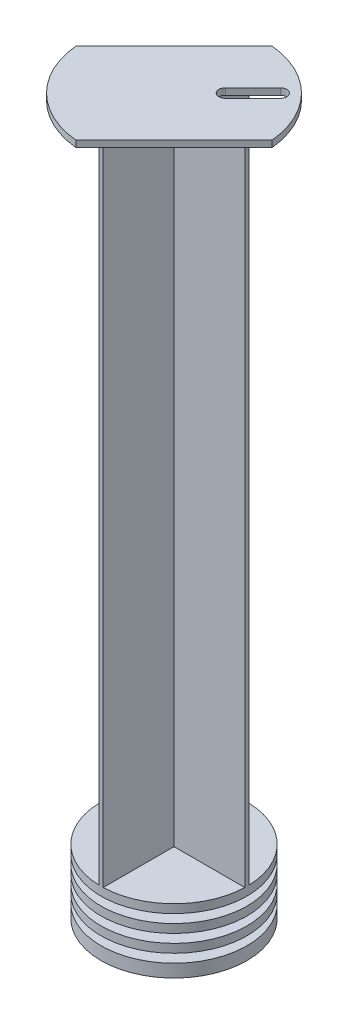
ISO-10303-21;
HEADER;
FILE_DESCRIPTION(('STEP AP214'),'2;1');
FILE_NAME('part.step','',(''),(''),'','','');
FILE_SCHEMA(('AUTOMOTIVE_DESIGN { 1 0 10303 214 1 1 1 1 }'));
ENDSEC;
DATA;
#1=APPLICATION_CONTEXT('core data for automotive mechanical design processes');
#2=APPLICATION_PROTOCOL_DEFINITION('international standard','automotive_design',2000,#1);
#3=PRODUCT_CONTEXT('',#1,'mechanical');
#4=PRODUCT('Part','Part','',(#3));
#5=PRODUCT_RELATED_PRODUCT_CATEGORY('part','',(#4));
#6=PRODUCT_DEFINITION_FORMATION('','',#4);
#7=PRODUCT_DEFINITION_CONTEXT('part definition',#1,'design');
#8=PRODUCT_DEFINITION('design','',#6,#7);
#9=PRODUCT_DEFINITION_SHAPE('','',#8);
#10=(LENGTH_UNIT() NAMED_UNIT(*) SI_UNIT(.MILLI.,.METRE.));
#11=(NAMED_UNIT(*) PLANE_ANGLE_UNIT() SI_UNIT($,.RADIAN.));
#12=(NAMED_UNIT(*) SI_UNIT($,.STERADIAN.) SOLID_ANGLE_UNIT());
#13=UNCERTAINTY_MEASURE_WITH_UNIT(LENGTH_MEASURE(1.E-05),#10,'distance_accuracy_value','');
#14=(GEOMETRIC_REPRESENTATION_CONTEXT(3) GLOBAL_UNCERTAINTY_ASSIGNED_CONTEXT((#13)) GLOBAL_UNIT_ASSIGNED_CONTEXT((#10,
#11,#12)) REPRESENTATION_CONTEXT('',''));
#15=CARTESIAN_POINT('',(0.,0.,0.));
#16=DIRECTION('',(0.,0.,1.));
#17=DIRECTION('',(1.,0.,0.));
#18=AXIS2_PLACEMENT_3D('',#15,#16,#17);
#19=CARTESIAN_POINT('',(0.,165.,0.));
#20=DIRECTION('',(0.,1.,0.));
#21=DIRECTION('',(0.,0.,1.));
#22=AXIS2_PLACEMENT_3D('',#19,#20,#21);
#23=PLANE('',#22);
#24=DIRECTION('',(0.,0.,1.));
#25=VECTOR('',#24,1.);
#26=CARTESIAN_POINT('',(0.5,165.,0.));
#27=LINE('',#26,#25);
#28=CARTESIAN_POINT('',(0.499999999999996,165.,0.5));
#29=VERTEX_POINT('',#28);
#30=CARTESIAN_POINT('',(0.499999999999993,165.,16.9926454679664));
#31=VERTEX_POINT('',#30);
#32=EDGE_CURVE('E597',#29,#31,#27,.T.);
#33=ORIENTED_EDGE('',*,*,#32,.F.);
#34=DIRECTION('',(1.,0.,0.));
#35=VECTOR('',#34,1.);
#36=CARTESIAN_POINT('',(0.,165.,0.5));
#37=LINE('',#36,#35);
#38=CARTESIAN_POINT('',(16.9926454679664,165.,0.499999999999993));
#39=VERTEX_POINT('',#38);
#40=EDGE_CURVE('E523',#29,#39,#37,.T.);
#41=ORIENTED_EDGE('',*,*,#40,.T.);
#42=CARTESIAN_POINT('',(0.,165.,0.));
#43=DIRECTION('',(0.,1.,0.));
#44=DIRECTION('',(0.,0.,1.));
#45=AXIS2_PLACEMENT_3D('',#42,#43,#44);
#46=CIRCLE('',#45,17.);
#47=CARTESIAN_POINT('',(16.9926454679664,165.,-0.499999999999992));
#48=VERTEX_POINT('',#47);
#49=EDGE_CURVE('E526',#39,#48,#46,.T.);
#50=ORIENTED_EDGE('',*,*,#49,.T.);
#51=DIRECTION('',(1.,0.,0.));
#52=VECTOR('',#51,1.);
#53=CARTESIAN_POINT('',(0.,165.,-0.5));
#54=LINE('',#53,#52);
#55=CARTESIAN_POINT('',(0.499999999999995,165.,-0.5));
#56=VERTEX_POINT('',#55);
#57=EDGE_CURVE('E530',#56,#48,#54,.T.);
#58=ORIENTED_EDGE('',*,*,#57,.F.);
#59=DIRECTION('',(0.,0.,-1.));
#60=VECTOR('',#59,1.);
#61=CARTESIAN_POINT('',(0.5,165.,0.));
#62=LINE('',#61,#60);
#63=CARTESIAN_POINT('',(0.49999999999999,165.,-16.9926454679664));
#64=VERTEX_POINT('',#63);
#65=EDGE_CURVE('E561',#56,#64,#62,.T.);
#66=ORIENTED_EDGE('',*,*,#65,.T.);
#67=CARTESIAN_POINT('',(0.,165.,0.));
#68=DIRECTION('',(0.,1.,0.));
#69=DIRECTION('',(0.,0.,1.));
#70=AXIS2_PLACEMENT_3D('',#67,#68,#69);
#71=CIRCLE('',#70,17.);
#72=CARTESIAN_POINT('',(-0.5,165.,-16.9926454679664));
#73=VERTEX_POINT('',#72);
#74=EDGE_CURVE('E564',#64,#73,#71,.T.);
#75=ORIENTED_EDGE('',*,*,#74,.T.);
#76=DIRECTION('',(0.,0.,-1.));
#77=VECTOR('',#76,1.);
#78=CARTESIAN_POINT('',(-0.5,165.,0.));
#79=LINE('',#78,#77);
#80=CARTESIAN_POINT('',(-0.5,165.,-0.5));
#81=VERTEX_POINT('',#80);
#82=EDGE_CURVE('E548',#81,#73,#79,.T.);
#83=ORIENTED_EDGE('',*,*,#82,.F.);
#84=DIRECTION('',(-1.,0.,0.));
#85=VECTOR('',#84,1.);
#86=CARTESIAN_POINT('',(0.,165.,-0.5));
#87=LINE('',#86,#85);
#88=CARTESIAN_POINT('',(-16.9926454679664,165.,-0.499999999999991));
#89=VERTEX_POINT('',#88);
#90=EDGE_CURVE('E551',#81,#89,#87,.T.);
#91=ORIENTED_EDGE('',*,*,#90,.T.);
#92=CARTESIAN_POINT('',(0.,165.,0.));
#93=DIRECTION('',(0.,1.,0.));
#94=DIRECTION('',(0.,0.,1.));
#95=AXIS2_PLACEMENT_3D('',#92,#93,#94);
#96=CIRCLE('',#95,17.);
#97=CARTESIAN_POINT('',(-16.9926454679664,165.,0.499999999999993));
#98=VERTEX_POINT('',#97);
#99=EDGE_CURVE('E555',#89,#98,#96,.T.);
#100=ORIENTED_EDGE('',*,*,#99,.T.);
#101=DIRECTION('',(-1.,0.,0.));
#102=VECTOR('',#101,1.);
#103=CARTESIAN_POINT('',(0.,165.,0.5));
#104=LINE('',#103,#102);
#105=CARTESIAN_POINT('',(-0.5,165.,0.499999999999997));
#106=VERTEX_POINT('',#105);
#107=EDGE_CURVE('E558',#106,#98,#104,.T.);
#108=ORIENTED_EDGE('',*,*,#107,.F.);
#109=DIRECTION('',(0.,0.,1.));
#110=VECTOR('',#109,1.);
#111=CARTESIAN_POINT('',(-0.5,165.,0.));
#112=LINE('',#111,#110);
#113=CARTESIAN_POINT('',(-0.5,165.,16.9926454679664));
#114=VERTEX_POINT('',#113);
#115=EDGE_CURVE('E590',#106,#114,#112,.T.);
#116=ORIENTED_EDGE('',*,*,#115,.T.);
#117=CARTESIAN_POINT('',(0.,165.,0.));
#118=DIRECTION('',(0.,1.,0.));
#119=DIRECTION('',(0.,0.,1.));
#120=AXIS2_PLACEMENT_3D('',#117,#118,#119);
#121=CIRCLE('',#120,17.);
#122=EDGE_CURVE('E593',#114,#31,#121,.T.);
#123=ORIENTED_EDGE('',*,*,#122,.T.);
#124=EDGE_LOOP('',(#33,#41,#50,#58,#66,#75,#83,#91,#100,#108,#116,#123));
#125=FACE_BOUND('',#124,.T.);
#126=CARTESIAN_POINT('',(12.3743686707646,165.,-12.3743686707645));
#127=DIRECTION('',(0.,1.,0.));
#128=DIRECTION('',(0.,0.,1.));
#129=AXIS2_PLACEMENT_3D('',#126,#127,#128);
#130=CIRCLE('',#129,1.5);
#131=CARTESIAN_POINT('',(13.4350288425445,165.,-11.3137084989847));
#132=VERTEX_POINT('',#131);
#133=CARTESIAN_POINT('',(11.3137084989848,165.,-13.4350288425443));
#134=VERTEX_POINT('',#133);
#135=EDGE_CURVE('E509',#132,#134,#130,.T.);
#136=ORIENTED_EDGE('',*,*,#135,.T.);
#137=DIRECTION('',(-0.707106781186551,0.,0.707106781186544));
#138=VECTOR('',#137,1.);
#139=CARTESIAN_POINT('',(-1.06066017177982,165.,-1.06066017177983));
#140=LINE('',#139,#138);
#141=CARTESIAN_POINT('',(4.91554219338316,165.,-7.03686253694274));
#142=VERTEX_POINT('',#141);
#143=EDGE_CURVE('E463',#134,#142,#140,.T.);
#144=ORIENTED_EDGE('',*,*,#143,.T.);
#145=CARTESIAN_POINT('',(5.97620236516298,165.,-5.97620236516291));
#146=DIRECTION('',(0.,1.,0.));
#147=DIRECTION('',(0.,0.,1.));
#148=AXIS2_PLACEMENT_3D('',#145,#146,#147);
#149=CIRCLE('',#148,1.5);
#150=CARTESIAN_POINT('',(7.03686253694279,165.,-4.91554219338309));
#151=VERTEX_POINT('',#150);
#152=EDGE_CURVE('E504',#142,#151,#149,.T.);
#153=ORIENTED_EDGE('',*,*,#152,.T.);
#154=DIRECTION('',(-0.707106781186551,0.,0.707106781186544));
#155=VECTOR('',#154,1.);
#156=CARTESIAN_POINT('',(1.06066017177982,165.,1.06066017177983));
#157=LINE('',#156,#155);
#158=EDGE_CURVE('E507',#132,#151,#157,.T.);
#159=ORIENTED_EDGE('',*,*,#158,.F.);
#160=EDGE_LOOP('',(#136,#144,#153,#159));
#161=FACE_BOUND('',#160,.T.);
#162=DIRECTION('',(-0.707106781186551,0.,0.707106781186544));
#163=VECTOR('',#162,1.);
#164=CARTESIAN_POINT('',(-9.4999999999999,165.,-9.49999999999999));
#165=LINE('',#164,#163);
#166=CARTESIAN_POINT('',(1.91271221051351,165.,-20.9127122105133));
#167=VERTEX_POINT('',#166);
#168=CARTESIAN_POINT('',(-20.9127122105133,165.,1.91271221051332));
#169=VERTEX_POINT('',#168);
#170=EDGE_CURVE('E512',#167,#169,#165,.T.);
#171=ORIENTED_EDGE('',*,*,#170,.F.);
#172=CARTESIAN_POINT('',(0.,165.,0.));
#173=DIRECTION('',(0.,1.,0.));
#174=DIRECTION('',(0.,0.,1.));
#175=AXIS2_PLACEMENT_3D('',#172,#173,#174);
#176=CIRCLE('',#175,21.);
#177=CARTESIAN_POINT('',(20.9127122105133,165.,-1.91271221051331));
#178=VERTEX_POINT('',#177);
#179=EDGE_CURVE('E520',#178,#167,#176,.T.);
#180=ORIENTED_EDGE('',*,*,#179,.F.);
#181=DIRECTION('',(-0.707106781186551,0.,0.707106781186544));
#182=VECTOR('',#181,1.);
#183=CARTESIAN_POINT('',(9.4999999999999,165.,9.5));
#184=LINE('',#183,#182);
#185=CARTESIAN_POINT('',(-1.91271221051352,165.,20.9127122105133));
#186=VERTEX_POINT('',#185);
#187=EDGE_CURVE('E500',#178,#186,#184,.T.);
#188=ORIENTED_EDGE('',*,*,#187,.T.);
#189=EDGE_CURVE('E514',#169,#186,#176,.T.);
#190=ORIENTED_EDGE('',*,*,#189,.F.);
#191=EDGE_LOOP('',(#171,#180,#188,#190));
#192=FACE_BOUND('',#191,.T.);
#193=ADVANCED_FACE('F319',(#125,#161,#192),#23,.F.);
#194=CARTESIAN_POINT('',(0.,166.5,0.));
#195=DIRECTION('',(0.,-1.,0.));
#196=DIRECTION('',(0.,0.,-1.));
#197=AXIS2_PLACEMENT_3D('',#194,#195,#196);
#198=CYLINDRICAL_SURFACE('',#197,21.);
#199=DIRECTION('',(0.,1.,0.));
#200=VECTOR('',#199,1.);
#201=CARTESIAN_POINT('',(1.91271221051351,161.5,-20.9127122105133));
#202=LINE('',#201,#200);
#203=CARTESIAN_POINT('',(1.91271221051351,166.5,-20.9127122105133));
#204=VERTEX_POINT('',#203);
#205=EDGE_CURVE('E492',#167,#204,#202,.T.);
#206=ORIENTED_EDGE('',*,*,#205,.T.);
#207=CARTESIAN_POINT('',(0.,166.5,0.));
#208=DIRECTION('',(0.,1.,0.));
#209=DIRECTION('',(0.,0.,1.));
#210=AXIS2_PLACEMENT_3D('',#207,#208,#209);
#211=CIRCLE('',#210,21.);
#212=CARTESIAN_POINT('',(20.9127122105133,166.5,-1.91271221051331));
#213=VERTEX_POINT('',#212);
#214=EDGE_CURVE('E515',#213,#204,#211,.T.);
#215=ORIENTED_EDGE('',*,*,#214,.F.);
#216=DIRECTION('',(0.,1.,0.));
#217=VECTOR('',#216,1.);
#218=CARTESIAN_POINT('',(20.9127122105133,161.5,-1.91271221051331));
#219=LINE('',#218,#217);
#220=EDGE_CURVE('E485',#178,#213,#219,.T.);
#221=ORIENTED_EDGE('',*,*,#220,.F.);
#222=ORIENTED_EDGE('',*,*,#179,.T.);
#223=EDGE_LOOP('',(#206,#215,#221,#222));
#224=FACE_BOUND('',#223,.T.);
#225=ADVANCED_FACE('F663',(#224),#198,.T.);
#226=DIRECTION('',(0.,1.,0.));
#227=VECTOR('',#226,1.);
#228=CARTESIAN_POINT('',(-20.9127122105133,161.5,1.91271221051332));
#229=LINE('',#228,#227);
#230=CARTESIAN_POINT('',(-20.9127122105133,166.5,1.91271221051332));
#231=VERTEX_POINT('',#230);
#232=EDGE_CURVE('E490',#169,#231,#229,.T.);
#233=ORIENTED_EDGE('',*,*,#232,.F.);
#234=ORIENTED_EDGE('',*,*,#189,.T.);
#235=DIRECTION('',(0.,1.,0.));
#236=VECTOR('',#235,1.);
#237=CARTESIAN_POINT('',(-1.91271221051352,161.5,20.9127122105133));
#238=LINE('',#237,#236);
#239=CARTESIAN_POINT('',(-1.91271221051352,166.5,20.9127122105133));
#240=VERTEX_POINT('',#239);
#241=EDGE_CURVE('E497',#186,#240,#238,.T.);
#242=ORIENTED_EDGE('',*,*,#241,.T.);
#243=EDGE_CURVE('E519',#231,#240,#211,.T.);
#244=ORIENTED_EDGE('',*,*,#243,.F.);
#245=EDGE_LOOP('',(#233,#234,#242,#244));
#246=FACE_BOUND('',#245,.T.);
#247=ADVANCED_FACE('F670',(#246),#198,.T.);
#248=CARTESIAN_POINT('',(0.,166.5,0.));
#249=DIRECTION('',(0.,1.,0.));
#250=DIRECTION('',(0.,0.,1.));
#251=AXIS2_PLACEMENT_3D('',#248,#249,#250);
#252=PLANE('',#251);
#253=DIRECTION('',(-0.707106781186551,0.,0.707106781186544));
#254=VECTOR('',#253,1.);
#255=CARTESIAN_POINT('',(-1.06066017177982,166.5,-1.06066017177983));
#256=LINE('',#255,#254);
#257=CARTESIAN_POINT('',(11.3137084989848,166.5,-13.4350288425443));
#258=VERTEX_POINT('',#257);
#259=CARTESIAN_POINT('',(4.91554219338316,166.5,-7.03686253694274));
#260=VERTEX_POINT('',#259);
#261=EDGE_CURVE('E343',#258,#260,#256,.T.);
#262=ORIENTED_EDGE('',*,*,#261,.F.);
#263=CARTESIAN_POINT('',(12.3743686707646,166.5,-12.3743686707645));
#264=DIRECTION('',(0.,1.,0.));
#265=DIRECTION('',(0.,0.,1.));
#266=AXIS2_PLACEMENT_3D('',#263,#264,#265);
#267=CIRCLE('',#266,1.5);
#268=CARTESIAN_POINT('',(13.4350288425445,166.5,-11.3137084989847));
#269=VERTEX_POINT('',#268);
#270=EDGE_CURVE('E470',#269,#258,#267,.T.);
#271=ORIENTED_EDGE('',*,*,#270,.F.);
#272=DIRECTION('',(-0.707106781186551,0.,0.707106781186544));
#273=VECTOR('',#272,1.);
#274=CARTESIAN_POINT('',(1.06066017177982,166.5,1.06066017177983));
#275=LINE('',#274,#273);
#276=CARTESIAN_POINT('',(7.03686253694279,166.5,-4.91554219338309));
#277=VERTEX_POINT('',#276);
#278=EDGE_CURVE('E476',#269,#277,#275,.T.);
#279=ORIENTED_EDGE('',*,*,#278,.T.);
#280=CARTESIAN_POINT('',(5.97620236516298,166.5,-5.97620236516291));
#281=DIRECTION('',(0.,1.,0.));
#282=DIRECTION('',(0.,0.,1.));
#283=AXIS2_PLACEMENT_3D('',#280,#281,#282);
#284=CIRCLE('',#283,1.5);
#285=EDGE_CURVE('E482',#260,#277,#284,.T.);
#286=ORIENTED_EDGE('',*,*,#285,.F.);
#287=EDGE_LOOP('',(#262,#271,#279,#286));
#288=FACE_BOUND('',#287,.T.);
#289=ORIENTED_EDGE('',*,*,#214,.T.);
#290=DIRECTION('',(-0.707106781186551,0.,0.707106781186544));
#291=VECTOR('',#290,1.);
#292=CARTESIAN_POINT('',(1.91271221051352,166.5,-20.9127122105133));
#293=LINE('',#292,#291);
#294=EDGE_CURVE('E467',#204,#231,#293,.T.);
#295=ORIENTED_EDGE('',*,*,#294,.T.);
#296=ORIENTED_EDGE('',*,*,#243,.T.);
#297=DIRECTION('',(-0.707106781186551,0.,0.707106781186544));
#298=VECTOR('',#297,1.);
#299=CARTESIAN_POINT('',(9.49999999999991,166.5,9.5));
#300=LINE('',#299,#298);
#301=EDGE_CURVE('E483',#213,#240,#300,.T.);
#302=ORIENTED_EDGE('',*,*,#301,.F.);
#303=EDGE_LOOP('',(#289,#295,#296,#302));
#304=FACE_BOUND('',#303,.T.);
#305=ADVANCED_FACE('F480',(#288,#304),#252,.T.);
#306=CARTESIAN_POINT('',(0.,15.,0.));
#307=DIRECTION('',(0.,1.,0.));
#308=DIRECTION('',(0.,0.,1.));
#309=AXIS2_PLACEMENT_3D('',#306,#307,#308);
#310=PLANE('',#309);
#311=DIRECTION('',(1.,0.,0.));
#312=VECTOR('',#311,1.);
#313=CARTESIAN_POINT('',(0.,15.,0.5));
#314=LINE('',#313,#312);
#315=CARTESIAN_POINT('',(0.499999999999996,15.,0.5));
#316=VERTEX_POINT('',#315);
#317=CARTESIAN_POINT('',(16.9926454679664,15.,0.499999999999993));
#318=VERTEX_POINT('',#317);
#319=EDGE_CURVE('E534',#316,#318,#314,.T.);
#320=ORIENTED_EDGE('',*,*,#319,.F.);
#321=DIRECTION('',(0.,0.,1.));
#322=VECTOR('',#321,1.);
#323=CARTESIAN_POINT('',(0.5,15.,0.));
#324=LINE('',#323,#322);
#325=CARTESIAN_POINT('',(0.499999999999993,15.,16.9926454679664));
#326=VERTEX_POINT('',#325);
#327=EDGE_CURVE('E594',#316,#326,#324,.T.);
#328=ORIENTED_EDGE('',*,*,#327,.T.);
#329=CARTESIAN_POINT('',(0.,15.,0.));
#330=DIRECTION('',(0.,1.,0.));
#331=DIRECTION('',(0.,0.,1.));
#332=AXIS2_PLACEMENT_3D('',#329,#330,#331);
#333=CIRCLE('',#332,17.);
#334=EDGE_CURVE('E12',#326,#318,#333,.T.);
#335=ORIENTED_EDGE('',*,*,#334,.T.);
#336=EDGE_LOOP('',(#320,#328,#335));
#337=FACE_BOUND('',#336,.T.);
#338=ADVANCED_FACE('F768',(#337),#310,.T.);
#339=DIRECTION('',(0.,0.,1.));
#340=VECTOR('',#339,1.);
#341=CARTESIAN_POINT('',(-0.5,15.,0.));
#342=LINE('',#341,#340);
#343=CARTESIAN_POINT('',(-0.5,15.,0.499999999999997));
#344=VERTEX_POINT('',#343);
#345=CARTESIAN_POINT('',(-0.5,15.,16.9926454679664));
#346=VERTEX_POINT('',#345);
#347=EDGE_CURVE('E518',#344,#346,#342,.T.);
#348=ORIENTED_EDGE('',*,*,#347,.F.);
#349=DIRECTION('',(-1.,0.,0.));
#350=VECTOR('',#349,1.);
#351=CARTESIAN_POINT('',(0.,15.,0.5));
#352=LINE('',#351,#350);
#353=CARTESIAN_POINT('',(-16.9926454679664,15.,0.499999999999993));
#354=VERTEX_POINT('',#353);
#355=EDGE_CURVE('E574',#344,#354,#352,.T.);
#356=ORIENTED_EDGE('',*,*,#355,.T.);
#357=EDGE_CURVE('E328',#354,#346,#333,.T.);
#358=ORIENTED_EDGE('',*,*,#357,.T.);
#359=EDGE_LOOP('',(#348,#356,#358));
#360=FACE_BOUND('',#359,.T.);
#361=ADVANCED_FACE('F770',(#360),#310,.T.);
#362=DIRECTION('',(-1.,0.,0.));
#363=VECTOR('',#362,1.);
#364=CARTESIAN_POINT('',(0.,15.,-0.5));
#365=LINE('',#364,#363);
#366=CARTESIAN_POINT('',(-0.5,15.,-0.5));
#367=VERTEX_POINT('',#366);
#368=CARTESIAN_POINT('',(-16.9926454679664,15.,-0.499999999999991));
#369=VERTEX_POINT('',#368);
#370=EDGE_CURVE('E571',#367,#369,#365,.T.);
#371=ORIENTED_EDGE('',*,*,#370,.F.);
#372=DIRECTION('',(0.,0.,-1.));
#373=VECTOR('',#372,1.);
#374=CARTESIAN_POINT('',(-0.5,15.,0.));
#375=LINE('',#374,#373);
#376=CARTESIAN_POINT('',(-0.5,15.,-16.9926454679664));
#377=VERTEX_POINT('',#376);
#378=EDGE_CURVE('E568',#367,#377,#375,.T.);
#379=ORIENTED_EDGE('',*,*,#378,.T.);
#380=EDGE_CURVE('E795',#377,#369,#333,.T.);
#381=ORIENTED_EDGE('',*,*,#380,.T.);
#382=EDGE_LOOP('',(#371,#379,#381));
#383=FACE_BOUND('',#382,.T.);
#384=ADVANCED_FACE('F762',(#383),#310,.T.);
#385=CARTESIAN_POINT('',(0.,15.,0.));
#386=DIRECTION('',(0.,-1.,0.));
#387=DIRECTION('',(0.,0.,-1.));
#388=AXIS2_PLACEMENT_3D('',#385,#386,#387);
#389=CYLINDRICAL_SURFACE('',#388,17.);
#390=ORIENTED_EDGE('',*,*,#334,.F.);
#391=DIRECTION('',(0.,-1.,0.));
#392=VECTOR('',#391,1.);
#393=CARTESIAN_POINT('',(0.499999999999993,165.,16.9926454679664));
#394=LINE('',#393,#392);
#395=EDGE_CURVE('E599',#31,#326,#394,.T.);
#396=ORIENTED_EDGE('',*,*,#395,.F.);
#397=ORIENTED_EDGE('',*,*,#122,.F.);
#398=DIRECTION('',(0.,-1.,0.));
#399=VECTOR('',#398,1.);
#400=CARTESIAN_POINT('',(-0.5,165.,16.9926454679664));
#401=LINE('',#400,#399);
#402=EDGE_CURVE('E572',#114,#346,#401,.T.);
#403=ORIENTED_EDGE('',*,*,#402,.T.);
#404=ORIENTED_EDGE('',*,*,#357,.F.);
#405=DIRECTION('',(0.,-1.,0.));
#406=VECTOR('',#405,1.);
#407=CARTESIAN_POINT('',(-16.9926454679664,165.,0.499999999999993));
#408=LINE('',#407,#406);
#409=EDGE_CURVE('E584',#98,#354,#408,.T.);
#410=ORIENTED_EDGE('',*,*,#409,.F.);
#411=ORIENTED_EDGE('',*,*,#99,.F.);
#412=DIRECTION('',(0.,-1.,0.));
#413=VECTOR('',#412,1.);
#414=CARTESIAN_POINT('',(-16.9926454679664,165.,-0.499999999999991));
#415=LINE('',#414,#413);
#416=EDGE_CURVE('E586',#89,#369,#415,.T.);
#417=ORIENTED_EDGE('',*,*,#416,.T.);
#418=ORIENTED_EDGE('',*,*,#380,.F.);
#419=DIRECTION('',(0.,-1.,0.));
#420=VECTOR('',#419,1.);
#421=CARTESIAN_POINT('',(-0.5,165.,-16.9926454679664));
#422=LINE('',#421,#420);
#423=EDGE_CURVE('E567',#73,#377,#422,.T.);
#424=ORIENTED_EDGE('',*,*,#423,.F.);
#425=ORIENTED_EDGE('',*,*,#74,.F.);
#426=DIRECTION('',(0.,-1.,0.));
#427=VECTOR('',#426,1.);
#428=CARTESIAN_POINT('',(0.49999999999999,165.,-16.9926454679664));
#429=LINE('',#428,#427);
#430=CARTESIAN_POINT('',(0.49999999999999,15.,-16.9926454679664));
#431=VERTEX_POINT('',#430);
#432=EDGE_CURVE('E579',#64,#431,#429,.T.);
#433=ORIENTED_EDGE('',*,*,#432,.T.);
#434=CARTESIAN_POINT('',(16.9926454679664,15.,-0.499999999999992));
#435=VERTEX_POINT('',#434);
#436=EDGE_CURVE('E327',#435,#431,#333,.T.);
#437=ORIENTED_EDGE('',*,*,#436,.F.);
#438=DIRECTION('',(0.,-1.,0.));
#439=VECTOR('',#438,1.);
#440=CARTESIAN_POINT('',(16.9926454679664,165.,-0.499999999999992));
#441=LINE('',#440,#439);
#442=EDGE_CURVE('E540',#48,#435,#441,.T.);
#443=ORIENTED_EDGE('',*,*,#442,.F.);
#444=ORIENTED_EDGE('',*,*,#49,.F.);
#445=DIRECTION('',(0.,-1.,0.));
#446=VECTOR('',#445,1.);
#447=CARTESIAN_POINT('',(16.9926454679664,165.,0.499999999999993));
#448=LINE('',#447,#446);
#449=EDGE_CURVE('E542',#39,#318,#448,.T.);
#450=ORIENTED_EDGE('',*,*,#449,.T.);
#451=EDGE_LOOP('',(#390,#396,#397,#403,#404,#410,#411,#417,#418,#424,#425,#433,#437,#443,#444,#450));
#452=FACE_BOUND('',#451,.T.);
#453=CARTESIAN_POINT('',(0.,13.,0.));
#454=DIRECTION('',(0.,-1.,0.));
#455=DIRECTION('',(0.,0.,-1.));
#456=AXIS2_PLACEMENT_3D('',#453,#454,#455);
#457=CIRCLE('',#456,17.);
#458=CARTESIAN_POINT('',(0.,13.,-17.));
#459=VERTEX_POINT('',#458);
#460=EDGE_CURVE('E609',#459,#459,#457,.T.);
#461=ORIENTED_EDGE('',*,*,#460,.F.);
#462=EDGE_LOOP('',(#461));
#463=FACE_BOUND('',#462,.T.);
#464=ADVANCED_FACE('F661',(#452,#463),#389,.T.);
#465=DIRECTION('',(0.,0.,-1.));
#466=VECTOR('',#465,1.);
#467=CARTESIAN_POINT('',(0.5,15.,0.));
#468=LINE('',#467,#466);
#469=CARTESIAN_POINT('',(0.499999999999995,15.,-0.5));
#470=VERTEX_POINT('',#469);
#471=EDGE_CURVE('E552',#470,#431,#468,.T.);
#472=ORIENTED_EDGE('',*,*,#471,.F.);
#473=DIRECTION('',(1.,0.,0.));
#474=VECTOR('',#473,1.);
#475=CARTESIAN_POINT('',(0.,15.,-0.5));
#476=LINE('',#475,#474);
#477=EDGE_CURVE('E527',#470,#435,#476,.T.);
#478=ORIENTED_EDGE('',*,*,#477,.T.);
#479=ORIENTED_EDGE('',*,*,#436,.T.);
#480=EDGE_LOOP('',(#472,#478,#479));
#481=FACE_BOUND('',#480,.T.);
#482=ADVANCED_FACE('F725',(#481),#310,.T.);
#483=CARTESIAN_POINT('',(-17.,11.,0.));
#484=DIRECTION('',(0.,1.,0.));
#485=DIRECTION('',(0.,0.,1.));
#486=AXIS2_PLACEMENT_3D('',#483,#484,#485);
#487=PLANE('',#486);
#488=CARTESIAN_POINT('',(0.,11.,0.));
#489=DIRECTION('',(0.,-1.,0.));
#490=DIRECTION('',(0.,0.,-1.));
#491=AXIS2_PLACEMENT_3D('',#488,#489,#490);
#492=CIRCLE('',#491,11.);
#493=CARTESIAN_POINT('',(0.,11.,-11.));
#494=VERTEX_POINT('',#493);
#495=EDGE_CURVE('E616',#494,#494,#492,.T.);
#496=ORIENTED_EDGE('',*,*,#495,.T.);
#497=EDGE_LOOP('',(#496));
#498=FACE_BOUND('',#497,.T.);
#499=CARTESIAN_POINT('',(0.,11.,0.));
#500=DIRECTION('',(0.,-1.,0.));
#501=DIRECTION('',(0.,0.,-1.));
#502=AXIS2_PLACEMENT_3D('',#499,#500,#501);
#503=CIRCLE('',#502,17.);
#504=CARTESIAN_POINT('',(0.,11.,-17.));
#505=VERTEX_POINT('',#504);
#506=EDGE_CURVE('E619',#505,#505,#503,.T.);
#507=ORIENTED_EDGE('',*,*,#506,.F.);
#508=EDGE_LOOP('',(#507));
#509=FACE_BOUND('',#508,.T.);
#510=ADVANCED_FACE('F721',(#498,#509),#487,.T.);
#511=CARTESIAN_POINT('',(0.,0.,0.));
#512=DIRECTION('',(0.,-1.,0.));
#513=DIRECTION('',(0.,0.,-1.));
#514=AXIS2_PLACEMENT_3D('',#511,#512,#513);
#515=CYLINDRICAL_SURFACE('',#514,11.);
#516=CARTESIAN_POINT('',(0.,13.,0.));
#517=DIRECTION('',(0.,-1.,0.));
#518=DIRECTION('',(0.,0.,-1.));
#519=AXIS2_PLACEMENT_3D('',#516,#517,#518);
#520=CIRCLE('',#519,11.);
#521=CARTESIAN_POINT('',(0.,13.,-11.));
#522=VERTEX_POINT('',#521);
#523=EDGE_CURVE('E612',#522,#522,#520,.T.);
#524=ORIENTED_EDGE('',*,*,#523,.T.);
#525=EDGE_LOOP('',(#524));
#526=FACE_BOUND('',#525,.T.);
#527=ORIENTED_EDGE('',*,*,#495,.F.);
#528=EDGE_LOOP('',(#527));
#529=FACE_BOUND('',#528,.T.);
#530=ADVANCED_FACE('F717',(#526,#529),#515,.T.);
#531=CARTESIAN_POINT('',(-17.,13.,0.));
#532=DIRECTION('',(0.,-1.,0.));
#533=DIRECTION('',(0.,0.,-1.));
#534=AXIS2_PLACEMENT_3D('',#531,#532,#533);
#535=PLANE('',#534);
#536=ORIENTED_EDGE('',*,*,#460,.T.);
#537=EDGE_LOOP('',(#536));
#538=FACE_BOUND('',#537,.T.);
#539=ORIENTED_EDGE('',*,*,#523,.F.);
#540=EDGE_LOOP('',(#539));
#541=FACE_BOUND('',#540,.T.);
#542=ADVANCED_FACE('F714',(#538,#541),#535,.T.);
#543=CARTESIAN_POINT('',(0.,9.,0.));
#544=DIRECTION('',(0.,-1.,0.));
#545=DIRECTION('',(0.,0.,-1.));
#546=AXIS2_PLACEMENT_3D('',#543,#544,#545);
#547=CIRCLE('',#546,17.);
#548=CARTESIAN_POINT('',(0.,9.,-17.));
#549=VERTEX_POINT('',#548);
#550=EDGE_CURVE('E622',#549,#549,#547,.T.);
#551=ORIENTED_EDGE('',*,*,#550,.F.);
#552=EDGE_LOOP('',(#551));
#553=FACE_BOUND('',#552,.T.);
#554=ORIENTED_EDGE('',*,*,#506,.T.);
#555=EDGE_LOOP('',(#554));
#556=FACE_BOUND('',#555,.T.);
#557=ADVANCED_FACE('F321',(#553,#556),#389,.T.);
#558=CARTESIAN_POINT('',(-17.,7.,0.));
#559=DIRECTION('',(0.,1.,0.));
#560=DIRECTION('',(0.,0.,1.));
#561=AXIS2_PLACEMENT_3D('',#558,#559,#560);
#562=PLANE('',#561);
#563=CARTESIAN_POINT('',(0.,7.,0.));
#564=DIRECTION('',(0.,-1.,0.));
#565=DIRECTION('',(0.,0.,-1.));
#566=AXIS2_PLACEMENT_3D('',#563,#564,#565);
#567=CIRCLE('',#566,11.);
#568=CARTESIAN_POINT('',(0.,7.,-11.));
#569=VERTEX_POINT('',#568);
#570=EDGE_CURVE('E629',#569,#569,#567,.T.);
#571=ORIENTED_EDGE('',*,*,#570,.T.);
#572=EDGE_LOOP('',(#571));
#573=FACE_BOUND('',#572,.T.);
#574=CARTESIAN_POINT('',(0.,7.,0.));
#575=DIRECTION('',(0.,-1.,0.));
#576=DIRECTION('',(0.,0.,-1.));
#577=AXIS2_PLACEMENT_3D('',#574,#575,#576);
#578=CIRCLE('',#577,17.);
#579=CARTESIAN_POINT('',(0.,7.,-17.));
#580=VERTEX_POINT('',#579);
#581=EDGE_CURVE('E613',#580,#580,#578,.T.);
#582=ORIENTED_EDGE('',*,*,#581,.F.);
#583=EDGE_LOOP('',(#582));
#584=FACE_BOUND('',#583,.T.);
#585=ADVANCED_FACE('F733',(#573,#584),#562,.T.);
#586=CARTESIAN_POINT('',(0.,0.,0.));
#587=DIRECTION('',(0.,-1.,0.));
#588=DIRECTION('',(0.,0.,-1.));
#589=AXIS2_PLACEMENT_3D('',#586,#587,#588);
#590=CYLINDRICAL_SURFACE('',#589,11.);
#591=CARTESIAN_POINT('',(0.,9.,0.));
#592=DIRECTION('',(0.,-1.,0.));
#593=DIRECTION('',(0.,0.,-1.));
#594=AXIS2_PLACEMENT_3D('',#591,#592,#593);
#595=CIRCLE('',#594,11.);
#596=CARTESIAN_POINT('',(0.,9.,-11.));
#597=VERTEX_POINT('',#596);
#598=EDGE_CURVE('E625',#597,#597,#595,.T.);
#599=ORIENTED_EDGE('',*,*,#598,.T.);
#600=EDGE_LOOP('',(#599));
#601=FACE_BOUND('',#600,.T.);
#602=ORIENTED_EDGE('',*,*,#570,.F.);
#603=EDGE_LOOP('',(#602));
#604=FACE_BOUND('',#603,.T.);
#605=ADVANCED_FACE('F729',(#601,#604),#590,.T.);
#606=CARTESIAN_POINT('',(-17.,9.,0.));
#607=DIRECTION('',(0.,-1.,0.));
#608=DIRECTION('',(0.,0.,-1.));
#609=AXIS2_PLACEMENT_3D('',#606,#607,#608);
#610=PLANE('',#609);
#611=ORIENTED_EDGE('',*,*,#550,.T.);
#612=EDGE_LOOP('',(#611));
#613=FACE_BOUND('',#612,.T.);
#614=ORIENTED_EDGE('',*,*,#598,.F.);
#615=EDGE_LOOP('',(#614));
#616=FACE_BOUND('',#615,.T.);
#617=ADVANCED_FACE('F659',(#613,#616),#610,.T.);
#618=CARTESIAN_POINT('',(0.,5.,0.));
#619=DIRECTION('',(0.,-1.,0.));
#620=DIRECTION('',(0.,0.,-1.));
#621=AXIS2_PLACEMENT_3D('',#618,#619,#620);
#622=CIRCLE('',#621,16.9999999999999);
#623=CARTESIAN_POINT('',(0.,5.,-16.9999999999999));
#624=VERTEX_POINT('',#623);
#625=EDGE_CURVE('E608',#624,#624,#622,.T.);
#626=ORIENTED_EDGE('',*,*,#625,.F.);
#627=EDGE_LOOP('',(#626));
#628=FACE_BOUND('',#627,.T.);
#629=ORIENTED_EDGE('',*,*,#581,.T.);
#630=EDGE_LOOP('',(#629));
#631=FACE_BOUND('',#630,.T.);
#632=ADVANCED_FACE('F649',(#628,#631),#389,.T.);
#633=CARTESIAN_POINT('',(-16.9999999999999,3.,0.));
#634=DIRECTION('',(0.,1.,0.));
#635=DIRECTION('',(0.,0.,1.));
#636=AXIS2_PLACEMENT_3D('',#633,#634,#635);
#637=PLANE('',#636);
#638=CARTESIAN_POINT('',(0.,3.,0.));
#639=DIRECTION('',(0.,-1.,0.));
#640=DIRECTION('',(0.,0.,-1.));
#641=AXIS2_PLACEMENT_3D('',#638,#639,#640);
#642=CIRCLE('',#641,10.9999999999999);
#643=CARTESIAN_POINT('',(0.,3.,-10.9999999999999));
#644=VERTEX_POINT('',#643);
#645=EDGE_CURVE('E639',#644,#644,#642,.T.);
#646=ORIENTED_EDGE('',*,*,#645,.T.);
#647=EDGE_LOOP('',(#646));
#648=FACE_BOUND('',#647,.T.);
#649=CARTESIAN_POINT('',(0.,3.,0.));
#650=DIRECTION('',(0.,-1.,0.));
#651=DIRECTION('',(0.,0.,-1.));
#652=AXIS2_PLACEMENT_3D('',#649,#650,#651);
#653=CIRCLE('',#652,16.9999999999999);
#654=CARTESIAN_POINT('',(0.,3.,-16.9999999999999));
#655=VERTEX_POINT('',#654);
#656=EDGE_CURVE('E626',#655,#655,#653,.T.);
#657=ORIENTED_EDGE('',*,*,#656,.F.);
#658=EDGE_LOOP('',(#657));
#659=FACE_BOUND('',#658,.T.);
#660=ADVANCED_FACE('F646',(#648,#659),#637,.T.);
#661=CARTESIAN_POINT('',(0.,0.,0.));
#662=DIRECTION('',(0.,-1.,0.));
#663=DIRECTION('',(0.,0.,-1.));
#664=AXIS2_PLACEMENT_3D('',#661,#662,#663);
#665=CYLINDRICAL_SURFACE('',#664,10.9999999999999);
#666=CARTESIAN_POINT('',(0.,5.,0.));
#667=DIRECTION('',(0.,-1.,0.));
#668=DIRECTION('',(0.,0.,-1.));
#669=AXIS2_PLACEMENT_3D('',#666,#667,#668);
#670=CIRCLE('',#669,10.9999999999999);
#671=CARTESIAN_POINT('',(0.,5.,-10.9999999999999));
#672=VERTEX_POINT('',#671);
#673=EDGE_CURVE('E636',#672,#672,#670,.T.);
#674=ORIENTED_EDGE('',*,*,#673,.T.);
#675=EDGE_LOOP('',(#674));
#676=FACE_BOUND('',#675,.T.);
#677=ORIENTED_EDGE('',*,*,#645,.F.);
#678=EDGE_LOOP('',(#677));
#679=FACE_BOUND('',#678,.T.);
#680=ADVANCED_FACE('F648',(#676,#679),#665,.T.);
#681=CARTESIAN_POINT('',(-16.9999999999999,5.,0.));
#682=DIRECTION('',(0.,-1.,0.));
#683=DIRECTION('',(0.,0.,-1.));
#684=AXIS2_PLACEMENT_3D('',#681,#682,#683);
#685=PLANE('',#684);
#686=ORIENTED_EDGE('',*,*,#625,.T.);
#687=EDGE_LOOP('',(#686));
#688=FACE_BOUND('',#687,.T.);
#689=ORIENTED_EDGE('',*,*,#673,.F.);
#690=EDGE_LOOP('',(#689));
#691=FACE_BOUND('',#690,.T.);
#692=ADVANCED_FACE('F656',(#688,#691),#685,.T.);
#693=CARTESIAN_POINT('',(0.,0.,0.));
#694=DIRECTION('',(0.,-1.,0.));
#695=DIRECTION('',(0.,0.,-1.));
#696=AXIS2_PLACEMENT_3D('',#693,#694,#695);
#697=CIRCLE('',#696,17.);
#698=CARTESIAN_POINT('',(0.,0.,-17.));
#699=VERTEX_POINT('',#698);
#700=EDGE_CURVE('E547',#699,#699,#697,.T.);
#701=ORIENTED_EDGE('',*,*,#700,.F.);
#702=EDGE_LOOP('',(#701));
#703=FACE_BOUND('',#702,.T.);
#704=ORIENTED_EDGE('',*,*,#656,.T.);
#705=EDGE_LOOP('',(#704));
#706=FACE_BOUND('',#705,.T.);
#707=ADVANCED_FACE('F644',(#703,#706),#389,.T.);
#708=CARTESIAN_POINT('',(0.,0.,0.));
#709=DIRECTION('',(0.,1.,0.));
#710=DIRECTION('',(0.,0.,1.));
#711=AXIS2_PLACEMENT_3D('',#708,#709,#710);
#712=CONICAL_SURFACE('',#711,17.,1.28474488507758);
#713=CARTESIAN_POINT('',(0.,-5.,0.));
#714=VERTEX_POINT('',#713);
#715=VERTEX_LOOP('',#714);
#716=FACE_BOUND('',#715,.T.);
#717=ORIENTED_EDGE('',*,*,#700,.T.);
#718=EDGE_LOOP('',(#717));
#719=FACE_BOUND('',#718,.T.);
#720=ADVANCED_FACE('F686',(#716,#719),#712,.T.);
#721=CARTESIAN_POINT('',(0.,165.,0.5));
#722=DIRECTION('',(0.,0.,-1.));
#723=DIRECTION('',(-1.,0.,0.));
#724=AXIS2_PLACEMENT_3D('',#721,#722,#723);
#725=PLANE('',#724);
#726=ORIENTED_EDGE('',*,*,#319,.T.);
#727=ORIENTED_EDGE('',*,*,#449,.F.);
#728=ORIENTED_EDGE('',*,*,#40,.F.);
#729=DIRECTION('',(0.,-1.,0.));
#730=VECTOR('',#729,1.);
#731=CARTESIAN_POINT('',(0.499999999999996,165.,0.5));
#732=LINE('',#731,#730);
#733=EDGE_CURVE('E545',#29,#316,#732,.T.);
#734=ORIENTED_EDGE('',*,*,#733,.T.);
#735=EDGE_LOOP('',(#726,#727,#728,#734));
#736=FACE_BOUND('',#735,.T.);
#737=ADVANCED_FACE('F682',(#736),#725,.F.);
#738=CARTESIAN_POINT('',(0.,165.,-0.5));
#739=DIRECTION('',(0.,0.,-1.));
#740=DIRECTION('',(-1.,0.,0.));
#741=AXIS2_PLACEMENT_3D('',#738,#739,#740);
#742=PLANE('',#741);
#743=ORIENTED_EDGE('',*,*,#477,.F.);
#744=DIRECTION('',(0.,-1.,0.));
#745=VECTOR('',#744,1.);
#746=CARTESIAN_POINT('',(0.499999999999995,165.,-0.5));
#747=LINE('',#746,#745);
#748=EDGE_CURVE('E533',#56,#470,#747,.T.);
#749=ORIENTED_EDGE('',*,*,#748,.F.);
#750=ORIENTED_EDGE('',*,*,#57,.T.);
#751=ORIENTED_EDGE('',*,*,#442,.T.);
#752=EDGE_LOOP('',(#743,#749,#750,#751));
#753=FACE_BOUND('',#752,.T.);
#754=ADVANCED_FACE('F678',(#753),#742,.T.);
#755=CARTESIAN_POINT('',(0.,165.,-0.5));
#756=DIRECTION('',(0.,0.,1.));
#757=DIRECTION('',(1.,0.,0.));
#758=AXIS2_PLACEMENT_3D('',#755,#756,#757);
#759=PLANE('',#758);
#760=ORIENTED_EDGE('',*,*,#370,.T.);
#761=ORIENTED_EDGE('',*,*,#416,.F.);
#762=ORIENTED_EDGE('',*,*,#90,.F.);
#763=DIRECTION('',(0.,-1.,0.));
#764=VECTOR('',#763,1.);
#765=CARTESIAN_POINT('',(-0.5,165.,-0.5));
#766=LINE('',#765,#764);
#767=EDGE_CURVE('E536',#81,#367,#766,.T.);
#768=ORIENTED_EDGE('',*,*,#767,.T.);
#769=EDGE_LOOP('',(#760,#761,#762,#768));
#770=FACE_BOUND('',#769,.T.);
#771=ADVANCED_FACE('F681',(#770),#759,.F.);
#772=CARTESIAN_POINT('',(0.,165.,0.5));
#773=DIRECTION('',(0.,0.,1.));
#774=DIRECTION('',(1.,0.,0.));
#775=AXIS2_PLACEMENT_3D('',#772,#773,#774);
#776=PLANE('',#775);
#777=ORIENTED_EDGE('',*,*,#355,.F.);
#778=DIRECTION('',(0.,-1.,0.));
#779=VECTOR('',#778,1.);
#780=CARTESIAN_POINT('',(-0.5,165.,0.499999999999997));
#781=LINE('',#780,#779);
#782=EDGE_CURVE('E582',#106,#344,#781,.T.);
#783=ORIENTED_EDGE('',*,*,#782,.F.);
#784=ORIENTED_EDGE('',*,*,#107,.T.);
#785=ORIENTED_EDGE('',*,*,#409,.T.);
#786=EDGE_LOOP('',(#777,#783,#784,#785));
#787=FACE_BOUND('',#786,.T.);
#788=ADVANCED_FACE('F694',(#787),#776,.T.);
#789=CARTESIAN_POINT('',(-0.5,165.,0.));
#790=DIRECTION('',(-1.,0.,0.));
#791=DIRECTION('',(0.,0.,1.));
#792=AXIS2_PLACEMENT_3D('',#789,#790,#791);
#793=PLANE('',#792);
#794=ORIENTED_EDGE('',*,*,#378,.F.);
#795=ORIENTED_EDGE('',*,*,#767,.F.);
#796=ORIENTED_EDGE('',*,*,#82,.T.);
#797=ORIENTED_EDGE('',*,*,#423,.T.);
#798=EDGE_LOOP('',(#794,#795,#796,#797));
#799=FACE_BOUND('',#798,.T.);
#800=ADVANCED_FACE('F697',(#799),#793,.T.);
#801=CARTESIAN_POINT('',(-0.5,165.,0.));
#802=DIRECTION('',(1.,0.,0.));
#803=DIRECTION('',(0.,0.,-1.));
#804=AXIS2_PLACEMENT_3D('',#801,#802,#803);
#805=PLANE('',#804);
#806=ORIENTED_EDGE('',*,*,#347,.T.);
#807=ORIENTED_EDGE('',*,*,#402,.F.);
#808=ORIENTED_EDGE('',*,*,#115,.F.);
#809=ORIENTED_EDGE('',*,*,#782,.T.);
#810=EDGE_LOOP('',(#806,#807,#808,#809));
#811=FACE_BOUND('',#810,.T.);
#812=ADVANCED_FACE('F692',(#811),#805,.F.);
#813=CARTESIAN_POINT('',(0.5,165.,0.));
#814=DIRECTION('',(-1.,0.,0.));
#815=DIRECTION('',(0.,0.,1.));
#816=AXIS2_PLACEMENT_3D('',#813,#814,#815);
#817=PLANE('',#816);
#818=ORIENTED_EDGE('',*,*,#471,.T.);
#819=ORIENTED_EDGE('',*,*,#432,.F.);
#820=ORIENTED_EDGE('',*,*,#65,.F.);
#821=ORIENTED_EDGE('',*,*,#748,.T.);
#822=EDGE_LOOP('',(#818,#819,#820,#821));
#823=FACE_BOUND('',#822,.T.);
#824=ADVANCED_FACE('F688',(#823),#817,.F.);
#825=CARTESIAN_POINT('',(0.5,165.,0.));
#826=DIRECTION('',(1.,0.,0.));
#827=DIRECTION('',(0.,0.,-1.));
#828=AXIS2_PLACEMENT_3D('',#825,#826,#827);
#829=PLANE('',#828);
#830=ORIENTED_EDGE('',*,*,#327,.F.);
#831=ORIENTED_EDGE('',*,*,#733,.F.);
#832=ORIENTED_EDGE('',*,*,#32,.T.);
#833=ORIENTED_EDGE('',*,*,#395,.T.);
#834=EDGE_LOOP('',(#830,#831,#832,#833));
#835=FACE_BOUND('',#834,.T.);
#836=ADVANCED_FACE('F691',(#835),#829,.T.);
#837=CARTESIAN_POINT('',(9.49999999999991,161.5,9.5));
#838=DIRECTION('',(-0.707106781186544,0.,-0.707106781186551));
#839=DIRECTION('',(-0.707106781186551,0.,0.707106781186544));
#840=AXIS2_PLACEMENT_3D('',#837,#838,#839);
#841=PLANE('',#840);
#842=ORIENTED_EDGE('',*,*,#220,.T.);
#843=ORIENTED_EDGE('',*,*,#301,.T.);
#844=ORIENTED_EDGE('',*,*,#241,.F.);
#845=ORIENTED_EDGE('',*,*,#187,.F.);
#846=EDGE_LOOP('',(#842,#843,#844,#845));
#847=FACE_BOUND('',#846,.T.);
#848=ADVANCED_FACE('F706',(#847),#841,.F.);
#849=CARTESIAN_POINT('',(-1.06066017177982,161.5,-1.06066017177983));
#850=DIRECTION('',(-0.707106781186544,0.,-0.707106781186551));
#851=DIRECTION('',(-0.707106781186551,0.,0.707106781186544));
#852=AXIS2_PLACEMENT_3D('',#849,#850,#851);
#853=PLANE('',#852);
#854=DIRECTION('',(0.,1.,0.));
#855=VECTOR('',#854,1.);
#856=CARTESIAN_POINT('',(11.3137084989848,161.5,-13.4350288425443));
#857=LINE('',#856,#855);
#858=EDGE_CURVE('E459',#134,#258,#857,.T.);
#859=ORIENTED_EDGE('',*,*,#858,.T.);
#860=ORIENTED_EDGE('',*,*,#261,.T.);
#861=DIRECTION('',(0.,1.,0.));
#862=VECTOR('',#861,1.);
#863=CARTESIAN_POINT('',(4.91554219338316,161.5,-7.03686253694274));
#864=LINE('',#863,#862);
#865=EDGE_CURVE('E477',#142,#260,#864,.T.);
#866=ORIENTED_EDGE('',*,*,#865,.F.);
#867=ORIENTED_EDGE('',*,*,#143,.F.);
#868=EDGE_LOOP('',(#859,#860,#866,#867));
#869=FACE_BOUND('',#868,.T.);
#870=ADVANCED_FACE('F461',(#869),#853,.F.);
#871=CARTESIAN_POINT('',(12.3743686707646,161.5,-12.3743686707645));
#872=DIRECTION('',(0.,1.,0.));
#873=DIRECTION('',(0.,0.,1.));
#874=AXIS2_PLACEMENT_3D('',#871,#872,#873);
#875=CYLINDRICAL_SURFACE('',#874,1.5);
#876=DIRECTION('',(0.,1.,0.));
#877=VECTOR('',#876,1.);
#878=CARTESIAN_POINT('',(13.4350288425445,161.5,-11.3137084989847));
#879=LINE('',#878,#877);
#880=EDGE_CURVE('E466',#132,#269,#879,.T.);
#881=ORIENTED_EDGE('',*,*,#880,.T.);
#882=ORIENTED_EDGE('',*,*,#270,.T.);
#883=ORIENTED_EDGE('',*,*,#858,.F.);
#884=ORIENTED_EDGE('',*,*,#135,.F.);
#885=EDGE_LOOP('',(#881,#882,#883,#884));
#886=FACE_BOUND('',#885,.T.);
#887=ADVANCED_FACE('F471',(#886),#875,.F.);
#888=CARTESIAN_POINT('',(1.06066017177982,161.5,1.06066017177983));
#889=DIRECTION('',(-0.707106781186544,0.,-0.707106781186551));
#890=DIRECTION('',(-0.707106781186551,0.,0.707106781186544));
#891=AXIS2_PLACEMENT_3D('',#888,#889,#890);
#892=PLANE('',#891);
#893=ORIENTED_EDGE('',*,*,#158,.T.);
#894=DIRECTION('',(0.,1.,0.));
#895=VECTOR('',#894,1.);
#896=CARTESIAN_POINT('',(7.03686253694279,161.5,-4.91554219338309));
#897=LINE('',#896,#895);
#898=EDGE_CURVE('E335',#151,#277,#897,.T.);
#899=ORIENTED_EDGE('',*,*,#898,.T.);
#900=ORIENTED_EDGE('',*,*,#278,.F.);
#901=ORIENTED_EDGE('',*,*,#880,.F.);
#902=EDGE_LOOP('',(#893,#899,#900,#901));
#903=FACE_BOUND('',#902,.T.);
#904=ADVANCED_FACE('F844',(#903),#892,.T.);
#905=CARTESIAN_POINT('',(5.97620236516298,161.5,-5.97620236516291));
#906=DIRECTION('',(0.,1.,0.));
#907=DIRECTION('',(0.,0.,1.));
#908=AXIS2_PLACEMENT_3D('',#905,#906,#907);
#909=CYLINDRICAL_SURFACE('',#908,1.5);
#910=ORIENTED_EDGE('',*,*,#865,.T.);
#911=ORIENTED_EDGE('',*,*,#285,.T.);
#912=ORIENTED_EDGE('',*,*,#898,.F.);
#913=ORIENTED_EDGE('',*,*,#152,.F.);
#914=EDGE_LOOP('',(#910,#911,#912,#913));
#915=FACE_BOUND('',#914,.T.);
#916=ADVANCED_FACE('F839',(#915),#909,.F.);
#917=CARTESIAN_POINT('',(1.91271221051352,161.5,-20.9127122105133));
#918=DIRECTION('',(-0.707106781186544,0.,-0.707106781186551));
#919=DIRECTION('',(-0.707106781186551,0.,0.707106781186544));
#920=AXIS2_PLACEMENT_3D('',#917,#918,#919);
#921=PLANE('',#920);
#922=ORIENTED_EDGE('',*,*,#170,.T.);
#923=ORIENTED_EDGE('',*,*,#232,.T.);
#924=ORIENTED_EDGE('',*,*,#294,.F.);
#925=ORIENTED_EDGE('',*,*,#205,.F.);
#926=EDGE_LOOP('',(#922,#923,#924,#925));
#927=FACE_BOUND('',#926,.T.);
#928=ADVANCED_FACE('F837',(#927),#921,.T.);
#929=CLOSED_SHELL('',(#193,#225,#247,#305,#338,#361,#384,#464,#482,#510,#530,#542,#557,#585,
#605,#617,#632,#660,#680,#692,#707,#720,#737,#754,#771,#788,#800,#812,#824,#836,#848,#870,#887,
#904,#916,#928));
#930=MANIFOLD_SOLID_BREP('B2',#929);
#931=ADVANCED_BREP_SHAPE_REPRESENTATION('',(#18,#930),#14);
#932=SHAPE_DEFINITION_REPRESENTATION(#9,#931);
ENDSEC;
END-ISO-10303-21;
